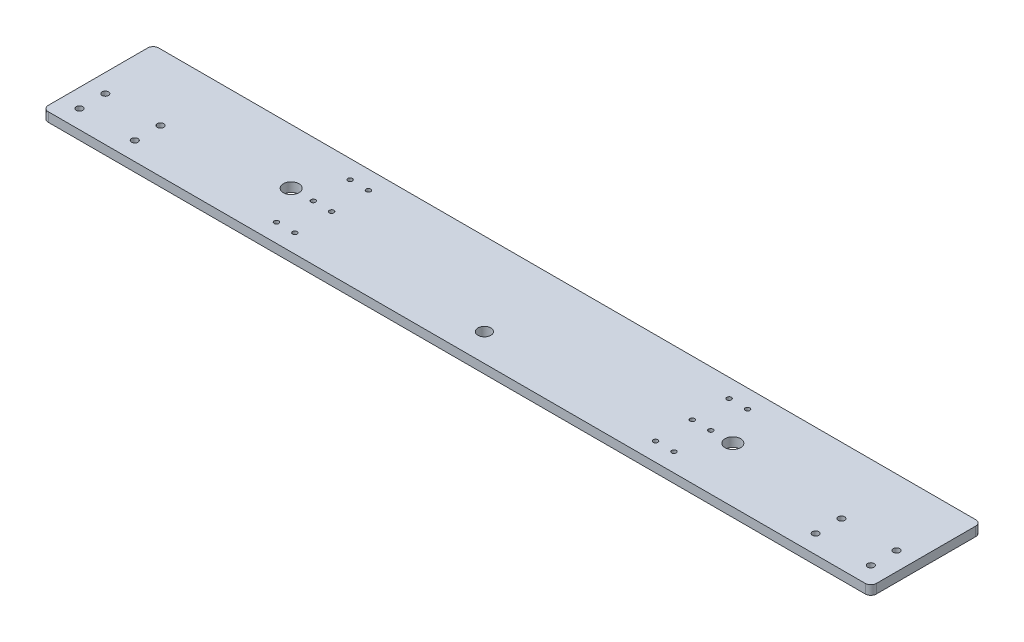
ISO-10303-21;
HEADER;
FILE_DESCRIPTION(('STEP AP214'),'2;1');
FILE_NAME('part.step','',(''),(''),'','','');
FILE_SCHEMA(('AUTOMOTIVE_DESIGN { 1 0 10303 214 1 1 1 1 }'));
ENDSEC;
DATA;
#1=APPLICATION_CONTEXT('core data for automotive mechanical design processes');
#2=APPLICATION_PROTOCOL_DEFINITION('international standard','automotive_design',2000,#1);
#3=PRODUCT_CONTEXT('',#1,'mechanical');
#4=PRODUCT('Part','Part','',(#3));
#5=PRODUCT_RELATED_PRODUCT_CATEGORY('part','',(#4));
#6=PRODUCT_DEFINITION_FORMATION('','',#4);
#7=PRODUCT_DEFINITION_CONTEXT('part definition',#1,'design');
#8=PRODUCT_DEFINITION('design','',#6,#7);
#9=PRODUCT_DEFINITION_SHAPE('','',#8);
#10=(LENGTH_UNIT() NAMED_UNIT(*) SI_UNIT(.MILLI.,.METRE.));
#11=(NAMED_UNIT(*) PLANE_ANGLE_UNIT() SI_UNIT($,.RADIAN.));
#12=(NAMED_UNIT(*) SI_UNIT($,.STERADIAN.) SOLID_ANGLE_UNIT());
#13=UNCERTAINTY_MEASURE_WITH_UNIT(LENGTH_MEASURE(1.E-05),#10,'distance_accuracy_value','');
#14=(GEOMETRIC_REPRESENTATION_CONTEXT(3) GLOBAL_UNCERTAINTY_ASSIGNED_CONTEXT((#13)) GLOBAL_UNIT_ASSIGNED_CONTEXT((#10,
#11,#12)) REPRESENTATION_CONTEXT('',''));
#15=CARTESIAN_POINT('',(0.,0.,0.));
#16=DIRECTION('',(0.,0.,1.));
#17=DIRECTION('',(1.,0.,0.));
#18=AXIS2_PLACEMENT_3D('',#15,#16,#17);
#19=CARTESIAN_POINT('',(-185.,-5.,5.99999999999999));
#20=DIRECTION('',(0.,1.,0.));
#21=DIRECTION('',(0.,0.,1.));
#22=AXIS2_PLACEMENT_3D('',#19,#20,#21);
#23=CYLINDRICAL_SURFACE('',#22,1.74999999999998);
#24=CARTESIAN_POINT('',(-185.,-5.,5.99999999999999));
#25=DIRECTION('',(0.,1.,0.));
#26=DIRECTION('',(0.,0.,1.));
#27=AXIS2_PLACEMENT_3D('',#24,#25,#26);
#28=CIRCLE('',#27,1.74999999999998);
#29=CARTESIAN_POINT('',(-185.,-5.,7.74999999999997));
#30=VERTEX_POINT('',#29);
#31=EDGE_CURVE('E145',#30,#30,#28,.T.);
#32=ORIENTED_EDGE('',*,*,#31,.F.);
#33=EDGE_LOOP('',(#32));
#34=FACE_BOUND('',#33,.T.);
#35=CARTESIAN_POINT('',(-185.,0.,5.99999999999999));
#36=DIRECTION('',(0.,1.,0.));
#37=DIRECTION('',(0.,0.,1.));
#38=AXIS2_PLACEMENT_3D('',#35,#36,#37);
#39=CIRCLE('',#38,1.74999999999998);
#40=CARTESIAN_POINT('',(-185.,0.,7.74999999999997));
#41=VERTEX_POINT('',#40);
#42=EDGE_CURVE('E117',#41,#41,#39,.T.);
#43=ORIENTED_EDGE('',*,*,#42,.T.);
#44=EDGE_LOOP('',(#43));
#45=FACE_BOUND('',#44,.T.);
#46=ADVANCED_FACE('F37',(#34,#45),#23,.F.);
#47=CARTESIAN_POINT('',(-185.,-5.,20.));
#48=DIRECTION('',(0.,1.,0.));
#49=DIRECTION('',(0.,0.,1.));
#50=AXIS2_PLACEMENT_3D('',#47,#48,#49);
#51=CYLINDRICAL_SURFACE('',#50,1.74999999999998);
#52=CARTESIAN_POINT('',(-185.,-5.,20.));
#53=DIRECTION('',(0.,1.,0.));
#54=DIRECTION('',(0.,0.,1.));
#55=AXIS2_PLACEMENT_3D('',#52,#53,#54);
#56=CIRCLE('',#55,1.74999999999998);
#57=CARTESIAN_POINT('',(-185.,-5.,21.75));
#58=VERTEX_POINT('',#57);
#59=EDGE_CURVE('E139',#58,#58,#56,.T.);
#60=ORIENTED_EDGE('',*,*,#59,.F.);
#61=EDGE_LOOP('',(#60));
#62=FACE_BOUND('',#61,.T.);
#63=CARTESIAN_POINT('',(-185.,0.,20.));
#64=DIRECTION('',(0.,1.,0.));
#65=DIRECTION('',(0.,0.,1.));
#66=AXIS2_PLACEMENT_3D('',#63,#64,#65);
#67=CIRCLE('',#66,1.74999999999998);
#68=CARTESIAN_POINT('',(-185.,0.,21.75));
#69=VERTEX_POINT('',#68);
#70=EDGE_CURVE('E142',#69,#69,#67,.T.);
#71=ORIENTED_EDGE('',*,*,#70,.T.);
#72=EDGE_LOOP('',(#71));
#73=FACE_BOUND('',#72,.T.);
#74=ADVANCED_FACE('F374',(#62,#73),#51,.F.);
#75=CARTESIAN_POINT('',(-225.,-5.,30.));
#76=DIRECTION('',(1.,0.,0.));
#77=DIRECTION('',(0.,0.,-1.));
#78=AXIS2_PLACEMENT_3D('',#75,#76,#77);
#79=PLANE('',#78);
#80=DIRECTION('',(0.,0.,-1.));
#81=VECTOR('',#80,1.);
#82=CARTESIAN_POINT('',(-225.,0.,30.));
#83=LINE('',#82,#81);
#84=CARTESIAN_POINT('',(-225.,0.,27.));
#85=VERTEX_POINT('',#84);
#86=CARTESIAN_POINT('',(-225.,0.,-27.));
#87=VERTEX_POINT('',#86);
#88=EDGE_CURVE('E113',#85,#87,#83,.T.);
#89=ORIENTED_EDGE('',*,*,#88,.T.);
#90=DIRECTION('',(0.,1.,0.));
#91=VECTOR('',#90,1.);
#92=CARTESIAN_POINT('',(-225.,-5.,-27.));
#93=LINE('',#92,#91);
#94=CARTESIAN_POINT('',(-225.,-5.,-27.));
#95=VERTEX_POINT('',#94);
#96=EDGE_CURVE('E157',#87,#95,#93,.F.);
#97=ORIENTED_EDGE('',*,*,#96,.T.);
#98=DIRECTION('',(0.,0.,-1.));
#99=VECTOR('',#98,1.);
#100=CARTESIAN_POINT('',(-225.,-5.,30.));
#101=LINE('',#100,#99);
#102=CARTESIAN_POINT('',(-225.,-5.,27.));
#103=VERTEX_POINT('',#102);
#104=EDGE_CURVE('E116',#103,#95,#101,.T.);
#105=ORIENTED_EDGE('',*,*,#104,.F.);
#106=DIRECTION('',(0.,1.,0.));
#107=VECTOR('',#106,1.);
#108=CARTESIAN_POINT('',(-225.,0.,27.));
#109=LINE('',#108,#107);
#110=EDGE_CURVE('E104',#103,#85,#109,.T.);
#111=ORIENTED_EDGE('',*,*,#110,.T.);
#112=EDGE_LOOP('',(#89,#97,#105,#111));
#113=FACE_BOUND('',#112,.T.);
#114=ADVANCED_FACE('F112',(#113),#79,.F.);
#115=CARTESIAN_POINT('',(-225.,-5.,-30.));
#116=DIRECTION('',(0.,0.,1.));
#117=DIRECTION('',(1.,0.,0.));
#118=AXIS2_PLACEMENT_3D('',#115,#116,#117);
#119=PLANE('',#118);
#120=DIRECTION('',(1.,0.,0.));
#121=VECTOR('',#120,1.);
#122=CARTESIAN_POINT('',(-225.,0.,-30.));
#123=LINE('',#122,#121);
#124=CARTESIAN_POINT('',(-222.,0.,-30.));
#125=VERTEX_POINT('',#124);
#126=CARTESIAN_POINT('',(222.,0.,-30.));
#127=VERTEX_POINT('',#126);
#128=EDGE_CURVE('E123',#125,#127,#123,.T.);
#129=ORIENTED_EDGE('',*,*,#128,.T.);
#130=DIRECTION('',(0.,1.,0.));
#131=VECTOR('',#130,1.);
#132=CARTESIAN_POINT('',(222.,-5.,-30.));
#133=LINE('',#132,#131);
#134=CARTESIAN_POINT('',(222.,-5.,-30.));
#135=VERTEX_POINT('',#134);
#136=EDGE_CURVE('E166',#127,#135,#133,.F.);
#137=ORIENTED_EDGE('',*,*,#136,.T.);
#138=DIRECTION('',(1.,0.,0.));
#139=VECTOR('',#138,1.);
#140=CARTESIAN_POINT('',(-225.,-5.,-30.));
#141=LINE('',#140,#139);
#142=CARTESIAN_POINT('',(-222.,-5.,-30.));
#143=VERTEX_POINT('',#142);
#144=EDGE_CURVE('E188',#143,#135,#141,.T.);
#145=ORIENTED_EDGE('',*,*,#144,.F.);
#146=DIRECTION('',(0.,1.,0.));
#147=VECTOR('',#146,1.);
#148=CARTESIAN_POINT('',(-222.,-5.,-30.));
#149=LINE('',#148,#147);
#150=EDGE_CURVE('E153',#143,#125,#149,.T.);
#151=ORIENTED_EDGE('',*,*,#150,.T.);
#152=EDGE_LOOP('',(#129,#137,#145,#151));
#153=FACE_BOUND('',#152,.T.);
#154=ADVANCED_FACE('F403',(#153),#119,.F.);
#155=CARTESIAN_POINT('',(225.,-5.,30.));
#156=DIRECTION('',(1.,0.,0.));
#157=DIRECTION('',(0.,0.,-1.));
#158=AXIS2_PLACEMENT_3D('',#155,#156,#157);
#159=PLANE('',#158);
#160=DIRECTION('',(0.,0.,-1.));
#161=VECTOR('',#160,1.);
#162=CARTESIAN_POINT('',(225.,0.,30.));
#163=LINE('',#162,#161);
#164=CARTESIAN_POINT('',(225.,0.,27.));
#165=VERTEX_POINT('',#164);
#166=CARTESIAN_POINT('',(225.,0.,-27.));
#167=VERTEX_POINT('',#166);
#168=EDGE_CURVE('E127',#165,#167,#163,.T.);
#169=ORIENTED_EDGE('',*,*,#168,.F.);
#170=DIRECTION('',(0.,1.,0.));
#171=VECTOR('',#170,1.);
#172=CARTESIAN_POINT('',(225.,-5.,27.));
#173=LINE('',#172,#171);
#174=CARTESIAN_POINT('',(225.,-5.,27.));
#175=VERTEX_POINT('',#174);
#176=EDGE_CURVE('E45',#165,#175,#173,.F.);
#177=ORIENTED_EDGE('',*,*,#176,.T.);
#178=DIRECTION('',(0.,0.,-1.));
#179=VECTOR('',#178,1.);
#180=CARTESIAN_POINT('',(225.,-5.,30.));
#181=LINE('',#180,#179);
#182=CARTESIAN_POINT('',(225.,-5.,-27.));
#183=VERTEX_POINT('',#182);
#184=EDGE_CURVE('E184',#175,#183,#181,.T.);
#185=ORIENTED_EDGE('',*,*,#184,.T.);
#186=DIRECTION('',(0.,1.,0.));
#187=VECTOR('',#186,1.);
#188=CARTESIAN_POINT('',(225.,0.,-27.));
#189=LINE('',#188,#187);
#190=EDGE_CURVE('E161',#183,#167,#189,.T.);
#191=ORIENTED_EDGE('',*,*,#190,.T.);
#192=EDGE_LOOP('',(#169,#177,#185,#191));
#193=FACE_BOUND('',#192,.T.);
#194=ADVANCED_FACE('F401',(#193),#159,.T.);
#195=CARTESIAN_POINT('',(-225.,-5.,30.));
#196=DIRECTION('',(0.,0.,1.));
#197=DIRECTION('',(1.,0.,0.));
#198=AXIS2_PLACEMENT_3D('',#195,#196,#197);
#199=PLANE('',#198);
#200=DIRECTION('',(1.,0.,0.));
#201=VECTOR('',#200,1.);
#202=CARTESIAN_POINT('',(-225.,-5.,30.));
#203=LINE('',#202,#201);
#204=CARTESIAN_POINT('',(-222.,-5.,30.));
#205=VERTEX_POINT('',#204);
#206=CARTESIAN_POINT('',(222.,-5.,30.));
#207=VERTEX_POINT('',#206);
#208=EDGE_CURVE('E133',#205,#207,#203,.T.);
#209=ORIENTED_EDGE('',*,*,#208,.T.);
#210=DIRECTION('',(0.,1.,0.));
#211=VECTOR('',#210,1.);
#212=CARTESIAN_POINT('',(222.,-5.,30.));
#213=LINE('',#212,#211);
#214=CARTESIAN_POINT('',(222.,0.,30.));
#215=VERTEX_POINT('',#214);
#216=EDGE_CURVE('E171',#207,#215,#213,.T.);
#217=ORIENTED_EDGE('',*,*,#216,.T.);
#218=DIRECTION('',(1.,0.,0.));
#219=VECTOR('',#218,1.);
#220=CARTESIAN_POINT('',(-225.,0.,30.));
#221=LINE('',#220,#219);
#222=CARTESIAN_POINT('',(-222.,0.,30.));
#223=VERTEX_POINT('',#222);
#224=EDGE_CURVE('E137',#223,#215,#221,.T.);
#225=ORIENTED_EDGE('',*,*,#224,.F.);
#226=DIRECTION('',(0.,1.,0.));
#227=VECTOR('',#226,1.);
#228=CARTESIAN_POINT('',(-222.,-5.,30.));
#229=LINE('',#228,#227);
#230=EDGE_CURVE('E105',#223,#205,#229,.F.);
#231=ORIENTED_EDGE('',*,*,#230,.T.);
#232=EDGE_LOOP('',(#209,#217,#225,#231));
#233=FACE_BOUND('',#232,.T.);
#234=ADVANCED_FACE('F177',(#233),#199,.T.);
#235=CARTESIAN_POINT('',(0.,-5.,0.));
#236=DIRECTION('',(0.,-1.,0.));
#237=DIRECTION('',(0.,0.,-1.));
#238=AXIS2_PLACEMENT_3D('',#235,#236,#237);
#239=PLANE('',#238);
#240=CARTESIAN_POINT('',(-98.,-5.,20.));
#241=DIRECTION('',(0.,1.,0.));
#242=DIRECTION('',(0.,0.,1.));
#243=AXIS2_PLACEMENT_3D('',#240,#241,#242);
#244=CIRCLE('',#243,1.25);
#245=CARTESIAN_POINT('',(-98.,-5.,21.25));
#246=VERTEX_POINT('',#245);
#247=EDGE_CURVE('E308',#246,#246,#244,.T.);
#248=ORIENTED_EDGE('',*,*,#247,.T.);
#249=EDGE_LOOP('',(#248));
#250=FACE_BOUND('',#249,.T.);
#251=CARTESIAN_POINT('',(-98.,-5.,0.));
#252=DIRECTION('',(0.,1.,0.));
#253=DIRECTION('',(0.,0.,1.));
#254=AXIS2_PLACEMENT_3D('',#251,#252,#253);
#255=CIRCLE('',#254,1.25);
#256=CARTESIAN_POINT('',(-98.,-5.,1.25));
#257=VERTEX_POINT('',#256);
#258=EDGE_CURVE('E302',#257,#257,#255,.T.);
#259=ORIENTED_EDGE('',*,*,#258,.T.);
#260=EDGE_LOOP('',(#259));
#261=FACE_BOUND('',#260,.T.);
#262=CARTESIAN_POINT('',(-98.,-5.,-20.));
#263=DIRECTION('',(0.,1.,0.));
#264=DIRECTION('',(0.,0.,1.));
#265=AXIS2_PLACEMENT_3D('',#262,#263,#264);
#266=CIRCLE('',#265,1.25);
#267=CARTESIAN_POINT('',(-98.,-5.,-18.75));
#268=VERTEX_POINT('',#267);
#269=EDGE_CURVE('E296',#268,#268,#266,.T.);
#270=ORIENTED_EDGE('',*,*,#269,.T.);
#271=EDGE_LOOP('',(#270));
#272=FACE_BOUND('',#271,.T.);
#273=CARTESIAN_POINT('',(-108.,-5.,-20.));
#274=DIRECTION('',(0.,1.,0.));
#275=DIRECTION('',(0.,0.,1.));
#276=AXIS2_PLACEMENT_3D('',#273,#274,#275);
#277=CIRCLE('',#276,1.25);
#278=CARTESIAN_POINT('',(-108.,-5.,-18.75));
#279=VERTEX_POINT('',#278);
#280=EDGE_CURVE('E290',#279,#279,#277,.T.);
#281=ORIENTED_EDGE('',*,*,#280,.T.);
#282=EDGE_LOOP('',(#281));
#283=FACE_BOUND('',#282,.T.);
#284=CARTESIAN_POINT('',(-108.,-5.,0.));
#285=DIRECTION('',(0.,1.,0.));
#286=DIRECTION('',(0.,0.,1.));
#287=AXIS2_PLACEMENT_3D('',#284,#285,#286);
#288=CIRCLE('',#287,1.25);
#289=CARTESIAN_POINT('',(-108.,-5.,1.25));
#290=VERTEX_POINT('',#289);
#291=EDGE_CURVE('E284',#290,#290,#288,.T.);
#292=ORIENTED_EDGE('',*,*,#291,.T.);
#293=EDGE_LOOP('',(#292));
#294=FACE_BOUND('',#293,.T.);
#295=CARTESIAN_POINT('',(-108.,-5.,20.));
#296=DIRECTION('',(0.,1.,0.));
#297=DIRECTION('',(0.,0.,1.));
#298=AXIS2_PLACEMENT_3D('',#295,#296,#297);
#299=CIRCLE('',#298,1.25);
#300=CARTESIAN_POINT('',(-108.,-5.,21.25));
#301=VERTEX_POINT('',#300);
#302=EDGE_CURVE('E278',#301,#301,#299,.T.);
#303=ORIENTED_EDGE('',*,*,#302,.T.);
#304=EDGE_LOOP('',(#303));
#305=FACE_BOUND('',#304,.T.);
#306=CARTESIAN_POINT('',(98.,-5.,20.));
#307=DIRECTION('',(0.,1.,0.));
#308=DIRECTION('',(0.,0.,1.));
#309=AXIS2_PLACEMENT_3D('',#306,#307,#308);
#310=CIRCLE('',#309,1.25);
#311=CARTESIAN_POINT('',(98.,-5.,21.25));
#312=VERTEX_POINT('',#311);
#313=EDGE_CURVE('E272',#312,#312,#310,.T.);
#314=ORIENTED_EDGE('',*,*,#313,.T.);
#315=EDGE_LOOP('',(#314));
#316=FACE_BOUND('',#315,.T.);
#317=CARTESIAN_POINT('',(108.,-5.,20.));
#318=DIRECTION('',(0.,1.,0.));
#319=DIRECTION('',(0.,0.,1.));
#320=AXIS2_PLACEMENT_3D('',#317,#318,#319);
#321=CIRCLE('',#320,1.25);
#322=CARTESIAN_POINT('',(108.,-5.,21.25));
#323=VERTEX_POINT('',#322);
#324=EDGE_CURVE('E266',#323,#323,#321,.T.);
#325=ORIENTED_EDGE('',*,*,#324,.T.);
#326=EDGE_LOOP('',(#325));
#327=FACE_BOUND('',#326,.T.);
#328=CARTESIAN_POINT('',(98.,-5.,0.));
#329=DIRECTION('',(0.,1.,0.));
#330=DIRECTION('',(0.,0.,1.));
#331=AXIS2_PLACEMENT_3D('',#328,#329,#330);
#332=CIRCLE('',#331,1.25);
#333=CARTESIAN_POINT('',(98.,-5.,1.25));
#334=VERTEX_POINT('',#333);
#335=EDGE_CURVE('E260',#334,#334,#332,.T.);
#336=ORIENTED_EDGE('',*,*,#335,.T.);
#337=EDGE_LOOP('',(#336));
#338=FACE_BOUND('',#337,.T.);
#339=CARTESIAN_POINT('',(108.,-5.,0.));
#340=DIRECTION('',(0.,1.,0.));
#341=DIRECTION('',(0.,0.,1.));
#342=AXIS2_PLACEMENT_3D('',#339,#340,#341);
#343=CIRCLE('',#342,1.25);
#344=CARTESIAN_POINT('',(108.,-5.,1.25));
#345=VERTEX_POINT('',#344);
#346=EDGE_CURVE('E254',#345,#345,#343,.T.);
#347=ORIENTED_EDGE('',*,*,#346,.T.);
#348=EDGE_LOOP('',(#347));
#349=FACE_BOUND('',#348,.T.);
#350=CARTESIAN_POINT('',(108.,-5.,-20.));
#351=DIRECTION('',(0.,1.,0.));
#352=DIRECTION('',(0.,0.,1.));
#353=AXIS2_PLACEMENT_3D('',#350,#351,#352);
#354=CIRCLE('',#353,1.25);
#355=CARTESIAN_POINT('',(108.,-5.,-18.75));
#356=VERTEX_POINT('',#355);
#357=EDGE_CURVE('E248',#356,#356,#354,.T.);
#358=ORIENTED_EDGE('',*,*,#357,.T.);
#359=EDGE_LOOP('',(#358));
#360=FACE_BOUND('',#359,.T.);
#361=CARTESIAN_POINT('',(98.,-5.,-20.));
#362=DIRECTION('',(0.,1.,0.));
#363=DIRECTION('',(0.,0.,1.));
#364=AXIS2_PLACEMENT_3D('',#361,#362,#363);
#365=CIRCLE('',#364,1.25);
#366=CARTESIAN_POINT('',(98.,-5.,-18.75));
#367=VERTEX_POINT('',#366);
#368=EDGE_CURVE('E242',#367,#367,#365,.T.);
#369=ORIENTED_EDGE('',*,*,#368,.T.);
#370=EDGE_LOOP('',(#369));
#371=FACE_BOUND('',#370,.T.);
#372=CARTESIAN_POINT('',(120.,-5.,0.));
#373=DIRECTION('',(0.,-1.,0.));
#374=DIRECTION('',(0.,0.,-1.));
#375=AXIS2_PLACEMENT_3D('',#372,#373,#374);
#376=CIRCLE('',#375,4.25000000000001);
#377=CARTESIAN_POINT('',(120.,-5.,-4.25000000000001));
#378=VERTEX_POINT('',#377);
#379=EDGE_CURVE('E236',#378,#378,#376,.F.);
#380=ORIENTED_EDGE('',*,*,#379,.T.);
#381=EDGE_LOOP('',(#380));
#382=FACE_BOUND('',#381,.T.);
#383=CARTESIAN_POINT('',(-120.,-5.,0.));
#384=DIRECTION('',(0.,-1.,0.));
#385=DIRECTION('',(0.,0.,-1.));
#386=AXIS2_PLACEMENT_3D('',#383,#384,#385);
#387=CIRCLE('',#386,4.25000000000001);
#388=CARTESIAN_POINT('',(-120.,-5.,-4.25000000000001));
#389=VERTEX_POINT('',#388);
#390=EDGE_CURVE('E217',#389,#389,#387,.T.);
#391=ORIENTED_EDGE('',*,*,#390,.F.);
#392=EDGE_LOOP('',(#391));
#393=FACE_BOUND('',#392,.T.);
#394=CARTESIAN_POINT('',(185.,-5.,20.));
#395=DIRECTION('',(0.,-1.,0.));
#396=DIRECTION('',(0.,0.,1.));
#397=AXIS2_PLACEMENT_3D('',#394,#395,#396);
#398=CIRCLE('',#397,1.74999999999998);
#399=CARTESIAN_POINT('',(185.,-5.,21.75));
#400=VERTEX_POINT('',#399);
#401=EDGE_CURVE('E210',#400,#400,#398,.T.);
#402=ORIENTED_EDGE('',*,*,#401,.F.);
#403=EDGE_LOOP('',(#402));
#404=FACE_BOUND('',#403,.T.);
#405=CARTESIAN_POINT('',(215.,-5.,5.99999999999999));
#406=DIRECTION('',(0.,-1.,0.));
#407=DIRECTION('',(0.,0.,1.));
#408=AXIS2_PLACEMENT_3D('',#405,#406,#407);
#409=CIRCLE('',#408,1.74999999999998);
#410=CARTESIAN_POINT('',(215.,-5.,7.74999999999997));
#411=VERTEX_POINT('',#410);
#412=EDGE_CURVE('E223',#411,#411,#409,.T.);
#413=ORIENTED_EDGE('',*,*,#412,.F.);
#414=EDGE_LOOP('',(#413));
#415=FACE_BOUND('',#414,.T.);
#416=CARTESIAN_POINT('',(185.,-5.,5.99999999999999));
#417=DIRECTION('',(0.,-1.,0.));
#418=DIRECTION('',(0.,0.,1.));
#419=AXIS2_PLACEMENT_3D('',#416,#417,#418);
#420=CIRCLE('',#419,1.74999999999998);
#421=CARTESIAN_POINT('',(185.,-5.,7.74999999999997));
#422=VERTEX_POINT('',#421);
#423=EDGE_CURVE('E216',#422,#422,#420,.T.);
#424=ORIENTED_EDGE('',*,*,#423,.F.);
#425=EDGE_LOOP('',(#424));
#426=FACE_BOUND('',#425,.T.);
#427=CARTESIAN_POINT('',(215.,-5.,20.));
#428=DIRECTION('',(0.,-1.,0.));
#429=DIRECTION('',(0.,0.,1.));
#430=AXIS2_PLACEMENT_3D('',#427,#428,#429);
#431=CIRCLE('',#430,1.74999999999998);
#432=CARTESIAN_POINT('',(215.,-5.,21.75));
#433=VERTEX_POINT('',#432);
#434=EDGE_CURVE('E206',#433,#433,#431,.T.);
#435=ORIENTED_EDGE('',*,*,#434,.F.);
#436=EDGE_LOOP('',(#435));
#437=FACE_BOUND('',#436,.T.);
#438=CARTESIAN_POINT('',(-215.,-5.,5.99999999999999));
#439=DIRECTION('',(0.,1.,0.));
#440=DIRECTION('',(0.,0.,1.));
#441=AXIS2_PLACEMENT_3D('',#438,#439,#440);
#442=CIRCLE('',#441,1.74999999999998);
#443=CARTESIAN_POINT('',(-215.,-5.,7.74999999999997));
#444=VERTEX_POINT('',#443);
#445=EDGE_CURVE('E203',#444,#444,#442,.T.);
#446=ORIENTED_EDGE('',*,*,#445,.T.);
#447=EDGE_LOOP('',(#446));
#448=FACE_BOUND('',#447,.T.);
#449=CARTESIAN_POINT('',(-215.,-5.,20.));
#450=DIRECTION('',(0.,1.,0.));
#451=DIRECTION('',(0.,0.,1.));
#452=AXIS2_PLACEMENT_3D('',#449,#450,#451);
#453=CIRCLE('',#452,1.74999999999998);
#454=CARTESIAN_POINT('',(-215.,-5.,21.75));
#455=VERTEX_POINT('',#454);
#456=EDGE_CURVE('E193',#455,#455,#453,.T.);
#457=ORIENTED_EDGE('',*,*,#456,.T.);
#458=EDGE_LOOP('',(#457));
#459=FACE_BOUND('',#458,.T.);
#460=CARTESIAN_POINT('',(0.,-5.,15.));
#461=DIRECTION('',(0.,1.,0.));
#462=DIRECTION('',(0.,0.,1.));
#463=AXIS2_PLACEMENT_3D('',#460,#461,#462);
#464=CIRCLE('',#463,3.5);
#465=CARTESIAN_POINT('',(0.,-5.,18.5));
#466=VERTEX_POINT('',#465);
#467=EDGE_CURVE('E124',#466,#466,#464,.T.);
#468=ORIENTED_EDGE('',*,*,#467,.T.);
#469=EDGE_LOOP('',(#468));
#470=FACE_BOUND('',#469,.T.);
#471=ORIENTED_EDGE('',*,*,#184,.F.);
#472=CARTESIAN_POINT('',(222.,-5.,27.));
#473=DIRECTION('',(0.,-1.,0.));
#474=DIRECTION('',(0.,0.,-1.));
#475=AXIS2_PLACEMENT_3D('',#472,#473,#474);
#476=CIRCLE('',#475,3.);
#477=EDGE_CURVE('E11',#175,#207,#476,.T.);
#478=ORIENTED_EDGE('',*,*,#477,.T.);
#479=ORIENTED_EDGE('',*,*,#208,.F.);
#480=CARTESIAN_POINT('',(-222.,-5.,27.));
#481=DIRECTION('',(0.,-1.,0.));
#482=DIRECTION('',(0.,0.,-1.));
#483=AXIS2_PLACEMENT_3D('',#480,#481,#482);
#484=CIRCLE('',#483,3.);
#485=EDGE_CURVE('E151',#205,#103,#484,.T.);
#486=ORIENTED_EDGE('',*,*,#485,.T.);
#487=ORIENTED_EDGE('',*,*,#104,.T.);
#488=CARTESIAN_POINT('',(-222.,-5.,-27.));
#489=DIRECTION('',(0.,-1.,0.));
#490=DIRECTION('',(0.,0.,-1.));
#491=AXIS2_PLACEMENT_3D('',#488,#489,#490);
#492=CIRCLE('',#491,3.);
#493=EDGE_CURVE('E159',#95,#143,#492,.T.);
#494=ORIENTED_EDGE('',*,*,#493,.T.);
#495=ORIENTED_EDGE('',*,*,#144,.T.);
#496=CARTESIAN_POINT('',(222.,-5.,-27.));
#497=DIRECTION('',(0.,-1.,0.));
#498=DIRECTION('',(0.,0.,-1.));
#499=AXIS2_PLACEMENT_3D('',#496,#497,#498);
#500=CIRCLE('',#499,3.);
#501=EDGE_CURVE('E168',#135,#183,#500,.T.);
#502=ORIENTED_EDGE('',*,*,#501,.T.);
#503=EDGE_LOOP('',(#471,#478,#479,#486,#487,#494,#495,#502));
#504=FACE_BOUND('',#503,.T.);
#505=ORIENTED_EDGE('',*,*,#59,.T.);
#506=EDGE_LOOP('',(#505));
#507=FACE_BOUND('',#506,.T.);
#508=ORIENTED_EDGE('',*,*,#31,.T.);
#509=EDGE_LOOP('',(#508));
#510=FACE_BOUND('',#509,.T.);
#511=ADVANCED_FACE('F182',(#250,#261,#272,#283,#294,#305,#316,#327,#338,#349,#360,#371,#382,
#393,#404,#415,#426,#437,#448,#459,#470,#504,#507,#510),#239,.T.);
#512=CARTESIAN_POINT('',(0.,0.,0.));
#513=DIRECTION('',(0.,-1.,0.));
#514=DIRECTION('',(0.,0.,-1.));
#515=AXIS2_PLACEMENT_3D('',#512,#513,#514);
#516=PLANE('',#515);
#517=CARTESIAN_POINT('',(-98.,0.,20.));
#518=DIRECTION('',(0.,1.,0.));
#519=DIRECTION('',(0.,0.,1.));
#520=AXIS2_PLACEMENT_3D('',#517,#518,#519);
#521=CIRCLE('',#520,1.24999999999999);
#522=CARTESIAN_POINT('',(-98.,0.,21.25));
#523=VERTEX_POINT('',#522);
#524=EDGE_CURVE('E311',#523,#523,#521,.T.);
#525=ORIENTED_EDGE('',*,*,#524,.F.);
#526=EDGE_LOOP('',(#525));
#527=FACE_BOUND('',#526,.T.);
#528=CARTESIAN_POINT('',(-98.,0.,0.));
#529=DIRECTION('',(0.,1.,0.));
#530=DIRECTION('',(0.,0.,1.));
#531=AXIS2_PLACEMENT_3D('',#528,#529,#530);
#532=CIRCLE('',#531,1.24999999999999);
#533=CARTESIAN_POINT('',(-98.,0.,1.24999999999998));
#534=VERTEX_POINT('',#533);
#535=EDGE_CURVE('E305',#534,#534,#532,.T.);
#536=ORIENTED_EDGE('',*,*,#535,.F.);
#537=EDGE_LOOP('',(#536));
#538=FACE_BOUND('',#537,.T.);
#539=CARTESIAN_POINT('',(-98.,0.,-20.));
#540=DIRECTION('',(0.,1.,0.));
#541=DIRECTION('',(0.,0.,1.));
#542=AXIS2_PLACEMENT_3D('',#539,#540,#541);
#543=CIRCLE('',#542,1.24999999999999);
#544=CARTESIAN_POINT('',(-98.,0.,-18.75));
#545=VERTEX_POINT('',#544);
#546=EDGE_CURVE('E299',#545,#545,#543,.T.);
#547=ORIENTED_EDGE('',*,*,#546,.F.);
#548=EDGE_LOOP('',(#547));
#549=FACE_BOUND('',#548,.T.);
#550=CARTESIAN_POINT('',(-108.,0.,-20.));
#551=DIRECTION('',(0.,1.,0.));
#552=DIRECTION('',(0.,0.,1.));
#553=AXIS2_PLACEMENT_3D('',#550,#551,#552);
#554=CIRCLE('',#553,1.24999999999999);
#555=CARTESIAN_POINT('',(-108.,0.,-18.75));
#556=VERTEX_POINT('',#555);
#557=EDGE_CURVE('E293',#556,#556,#554,.T.);
#558=ORIENTED_EDGE('',*,*,#557,.F.);
#559=EDGE_LOOP('',(#558));
#560=FACE_BOUND('',#559,.T.);
#561=CARTESIAN_POINT('',(-108.,0.,0.));
#562=DIRECTION('',(0.,1.,0.));
#563=DIRECTION('',(0.,0.,1.));
#564=AXIS2_PLACEMENT_3D('',#561,#562,#563);
#565=CIRCLE('',#564,1.24999999999999);
#566=CARTESIAN_POINT('',(-108.,0.,1.24999999999998));
#567=VERTEX_POINT('',#566);
#568=EDGE_CURVE('E287',#567,#567,#565,.T.);
#569=ORIENTED_EDGE('',*,*,#568,.F.);
#570=EDGE_LOOP('',(#569));
#571=FACE_BOUND('',#570,.T.);
#572=CARTESIAN_POINT('',(-108.,0.,20.));
#573=DIRECTION('',(0.,1.,0.));
#574=DIRECTION('',(0.,0.,1.));
#575=AXIS2_PLACEMENT_3D('',#572,#573,#574);
#576=CIRCLE('',#575,1.24999999999999);
#577=CARTESIAN_POINT('',(-108.,0.,21.25));
#578=VERTEX_POINT('',#577);
#579=EDGE_CURVE('E281',#578,#578,#576,.T.);
#580=ORIENTED_EDGE('',*,*,#579,.F.);
#581=EDGE_LOOP('',(#580));
#582=FACE_BOUND('',#581,.T.);
#583=CARTESIAN_POINT('',(98.,0.,20.));
#584=DIRECTION('',(0.,1.,0.));
#585=DIRECTION('',(0.,0.,1.));
#586=AXIS2_PLACEMENT_3D('',#583,#584,#585);
#587=CIRCLE('',#586,1.24999999999999);
#588=CARTESIAN_POINT('',(98.,0.,21.25));
#589=VERTEX_POINT('',#588);
#590=EDGE_CURVE('E275',#589,#589,#587,.T.);
#591=ORIENTED_EDGE('',*,*,#590,.F.);
#592=EDGE_LOOP('',(#591));
#593=FACE_BOUND('',#592,.T.);
#594=CARTESIAN_POINT('',(108.,0.,20.));
#595=DIRECTION('',(0.,1.,0.));
#596=DIRECTION('',(0.,0.,1.));
#597=AXIS2_PLACEMENT_3D('',#594,#595,#596);
#598=CIRCLE('',#597,1.24999999999999);
#599=CARTESIAN_POINT('',(108.,0.,21.25));
#600=VERTEX_POINT('',#599);
#601=EDGE_CURVE('E269',#600,#600,#598,.T.);
#602=ORIENTED_EDGE('',*,*,#601,.F.);
#603=EDGE_LOOP('',(#602));
#604=FACE_BOUND('',#603,.T.);
#605=CARTESIAN_POINT('',(98.,0.,0.));
#606=DIRECTION('',(0.,1.,0.));
#607=DIRECTION('',(0.,0.,1.));
#608=AXIS2_PLACEMENT_3D('',#605,#606,#607);
#609=CIRCLE('',#608,1.24999999999999);
#610=CARTESIAN_POINT('',(98.,0.,1.24999999999998));
#611=VERTEX_POINT('',#610);
#612=EDGE_CURVE('E263',#611,#611,#609,.T.);
#613=ORIENTED_EDGE('',*,*,#612,.F.);
#614=EDGE_LOOP('',(#613));
#615=FACE_BOUND('',#614,.T.);
#616=CARTESIAN_POINT('',(108.,0.,0.));
#617=DIRECTION('',(0.,1.,0.));
#618=DIRECTION('',(0.,0.,1.));
#619=AXIS2_PLACEMENT_3D('',#616,#617,#618);
#620=CIRCLE('',#619,1.24999999999999);
#621=CARTESIAN_POINT('',(108.,0.,1.24999999999998));
#622=VERTEX_POINT('',#621);
#623=EDGE_CURVE('E257',#622,#622,#620,.T.);
#624=ORIENTED_EDGE('',*,*,#623,.F.);
#625=EDGE_LOOP('',(#624));
#626=FACE_BOUND('',#625,.T.);
#627=CARTESIAN_POINT('',(108.,0.,-20.));
#628=DIRECTION('',(0.,1.,0.));
#629=DIRECTION('',(0.,0.,1.));
#630=AXIS2_PLACEMENT_3D('',#627,#628,#629);
#631=CIRCLE('',#630,1.24999999999999);
#632=CARTESIAN_POINT('',(108.,0.,-18.75));
#633=VERTEX_POINT('',#632);
#634=EDGE_CURVE('E251',#633,#633,#631,.T.);
#635=ORIENTED_EDGE('',*,*,#634,.F.);
#636=EDGE_LOOP('',(#635));
#637=FACE_BOUND('',#636,.T.);
#638=CARTESIAN_POINT('',(98.,0.,-20.));
#639=DIRECTION('',(0.,1.,0.));
#640=DIRECTION('',(0.,0.,1.));
#641=AXIS2_PLACEMENT_3D('',#638,#639,#640);
#642=CIRCLE('',#641,1.24999999999999);
#643=CARTESIAN_POINT('',(98.,0.,-18.75));
#644=VERTEX_POINT('',#643);
#645=EDGE_CURVE('E245',#644,#644,#642,.T.);
#646=ORIENTED_EDGE('',*,*,#645,.F.);
#647=EDGE_LOOP('',(#646));
#648=FACE_BOUND('',#647,.T.);
#649=CARTESIAN_POINT('',(120.,0.,0.));
#650=DIRECTION('',(0.,-1.,0.));
#651=DIRECTION('',(0.,0.,1.));
#652=AXIS2_PLACEMENT_3D('',#649,#650,#651);
#653=CIRCLE('',#652,4.25000000000001);
#654=CARTESIAN_POINT('',(120.,0.,4.25000000000001));
#655=VERTEX_POINT('',#654);
#656=EDGE_CURVE('E239',#655,#655,#653,.T.);
#657=ORIENTED_EDGE('',*,*,#656,.T.);
#658=EDGE_LOOP('',(#657));
#659=FACE_BOUND('',#658,.T.);
#660=CARTESIAN_POINT('',(-120.,0.,0.));
#661=DIRECTION('',(0.,1.,0.));
#662=DIRECTION('',(0.,0.,1.));
#663=AXIS2_PLACEMENT_3D('',#660,#661,#662);
#664=CIRCLE('',#663,4.25000000000001);
#665=CARTESIAN_POINT('',(-120.,0.,4.25000000000001));
#666=VERTEX_POINT('',#665);
#667=EDGE_CURVE('E233',#666,#666,#664,.T.);
#668=ORIENTED_EDGE('',*,*,#667,.F.);
#669=EDGE_LOOP('',(#668));
#670=FACE_BOUND('',#669,.T.);
#671=CARTESIAN_POINT('',(185.,0.,20.));
#672=DIRECTION('',(0.,-1.,0.));
#673=DIRECTION('',(0.,0.,1.));
#674=AXIS2_PLACEMENT_3D('',#671,#672,#673);
#675=CIRCLE('',#674,1.74999999999998);
#676=CARTESIAN_POINT('',(185.,0.,21.75));
#677=VERTEX_POINT('',#676);
#678=EDGE_CURVE('E226',#677,#677,#675,.T.);
#679=ORIENTED_EDGE('',*,*,#678,.T.);
#680=EDGE_LOOP('',(#679));
#681=FACE_BOUND('',#680,.T.);
#682=CARTESIAN_POINT('',(215.,0.,5.99999999999999));
#683=DIRECTION('',(0.,-1.,0.));
#684=DIRECTION('',(0.,0.,1.));
#685=AXIS2_PLACEMENT_3D('',#682,#683,#684);
#686=CIRCLE('',#685,1.74999999999998);
#687=CARTESIAN_POINT('',(215.,0.,7.74999999999997));
#688=VERTEX_POINT('',#687);
#689=EDGE_CURVE('E220',#688,#688,#686,.T.);
#690=ORIENTED_EDGE('',*,*,#689,.T.);
#691=EDGE_LOOP('',(#690));
#692=FACE_BOUND('',#691,.T.);
#693=CARTESIAN_POINT('',(185.,0.,5.99999999999999));
#694=DIRECTION('',(0.,-1.,0.));
#695=DIRECTION('',(0.,0.,1.));
#696=AXIS2_PLACEMENT_3D('',#693,#694,#695);
#697=CIRCLE('',#696,1.74999999999998);
#698=CARTESIAN_POINT('',(185.,0.,7.74999999999997));
#699=VERTEX_POINT('',#698);
#700=EDGE_CURVE('E213',#699,#699,#697,.T.);
#701=ORIENTED_EDGE('',*,*,#700,.T.);
#702=EDGE_LOOP('',(#701));
#703=FACE_BOUND('',#702,.T.);
#704=CARTESIAN_POINT('',(215.,0.,20.));
#705=DIRECTION('',(0.,-1.,0.));
#706=DIRECTION('',(0.,0.,1.));
#707=AXIS2_PLACEMENT_3D('',#704,#705,#706);
#708=CIRCLE('',#707,1.74999999999998);
#709=CARTESIAN_POINT('',(215.,0.,21.75));
#710=VERTEX_POINT('',#709);
#711=EDGE_CURVE('E207',#710,#710,#708,.T.);
#712=ORIENTED_EDGE('',*,*,#711,.T.);
#713=EDGE_LOOP('',(#712));
#714=FACE_BOUND('',#713,.T.);
#715=CARTESIAN_POINT('',(-215.,0.,5.99999999999999));
#716=DIRECTION('',(0.,1.,0.));
#717=DIRECTION('',(0.,0.,1.));
#718=AXIS2_PLACEMENT_3D('',#715,#716,#717);
#719=CIRCLE('',#718,1.74999999999998);
#720=CARTESIAN_POINT('',(-215.,0.,7.74999999999997));
#721=VERTEX_POINT('',#720);
#722=EDGE_CURVE('E198',#721,#721,#719,.T.);
#723=ORIENTED_EDGE('',*,*,#722,.F.);
#724=EDGE_LOOP('',(#723));
#725=FACE_BOUND('',#724,.T.);
#726=CARTESIAN_POINT('',(-215.,0.,20.));
#727=DIRECTION('',(0.,1.,0.));
#728=DIRECTION('',(0.,0.,1.));
#729=AXIS2_PLACEMENT_3D('',#726,#727,#728);
#730=CIRCLE('',#729,1.74999999999998);
#731=CARTESIAN_POINT('',(-215.,0.,21.75));
#732=VERTEX_POINT('',#731);
#733=EDGE_CURVE('E195',#732,#732,#730,.T.);
#734=ORIENTED_EDGE('',*,*,#733,.F.);
#735=EDGE_LOOP('',(#734));
#736=FACE_BOUND('',#735,.T.);
#737=CARTESIAN_POINT('',(0.,0.,15.));
#738=DIRECTION('',(0.,1.,0.));
#739=DIRECTION('',(0.,0.,1.));
#740=AXIS2_PLACEMENT_3D('',#737,#738,#739);
#741=CIRCLE('',#740,3.5);
#742=CARTESIAN_POINT('',(0.,0.,18.5));
#743=VERTEX_POINT('',#742);
#744=EDGE_CURVE('E130',#743,#743,#741,.T.);
#745=ORIENTED_EDGE('',*,*,#744,.F.);
#746=EDGE_LOOP('',(#745));
#747=FACE_BOUND('',#746,.T.);
#748=ORIENTED_EDGE('',*,*,#224,.T.);
#749=CARTESIAN_POINT('',(222.,0.,27.));
#750=DIRECTION('',(0.,-1.,0.));
#751=DIRECTION('',(0.,0.,-1.));
#752=AXIS2_PLACEMENT_3D('',#749,#750,#751);
#753=CIRCLE('',#752,3.);
#754=EDGE_CURVE('E59',#215,#165,#753,.F.);
#755=ORIENTED_EDGE('',*,*,#754,.T.);
#756=ORIENTED_EDGE('',*,*,#168,.T.);
#757=CARTESIAN_POINT('',(222.,0.,-27.));
#758=DIRECTION('',(0.,-1.,0.));
#759=DIRECTION('',(0.,0.,-1.));
#760=AXIS2_PLACEMENT_3D('',#757,#758,#759);
#761=CIRCLE('',#760,3.);
#762=EDGE_CURVE('E164',#167,#127,#761,.F.);
#763=ORIENTED_EDGE('',*,*,#762,.T.);
#764=ORIENTED_EDGE('',*,*,#128,.F.);
#765=CARTESIAN_POINT('',(-222.,0.,-27.));
#766=DIRECTION('',(0.,-1.,0.));
#767=DIRECTION('',(0.,0.,-1.));
#768=AXIS2_PLACEMENT_3D('',#765,#766,#767);
#769=CIRCLE('',#768,3.);
#770=EDGE_CURVE('E122',#125,#87,#769,.F.);
#771=ORIENTED_EDGE('',*,*,#770,.T.);
#772=ORIENTED_EDGE('',*,*,#88,.F.);
#773=CARTESIAN_POINT('',(-222.,0.,27.));
#774=DIRECTION('',(0.,-1.,0.));
#775=DIRECTION('',(0.,0.,-1.));
#776=AXIS2_PLACEMENT_3D('',#773,#774,#775);
#777=CIRCLE('',#776,3.);
#778=EDGE_CURVE('E100',#85,#223,#777,.F.);
#779=ORIENTED_EDGE('',*,*,#778,.T.);
#780=EDGE_LOOP('',(#748,#755,#756,#763,#764,#771,#772,#779));
#781=FACE_BOUND('',#780,.T.);
#782=ORIENTED_EDGE('',*,*,#70,.F.);
#783=EDGE_LOOP('',(#782));
#784=FACE_BOUND('',#783,.T.);
#785=ORIENTED_EDGE('',*,*,#42,.F.);
#786=EDGE_LOOP('',(#785));
#787=FACE_BOUND('',#786,.T.);
#788=ADVANCED_FACE('F119',(#527,#538,#549,#560,#571,#582,#593,#604,#615,#626,#637,#648,#659,
#670,#681,#692,#703,#714,#725,#736,#747,#781,#784,#787),#516,.F.);
#789=CARTESIAN_POINT('',(0.,-5.,15.));
#790=DIRECTION('',(0.,1.,0.));
#791=DIRECTION('',(0.,0.,1.));
#792=AXIS2_PLACEMENT_3D('',#789,#790,#791);
#793=CYLINDRICAL_SURFACE('',#792,3.5);
#794=ORIENTED_EDGE('',*,*,#467,.F.);
#795=EDGE_LOOP('',(#794));
#796=FACE_BOUND('',#795,.T.);
#797=ORIENTED_EDGE('',*,*,#744,.T.);
#798=EDGE_LOOP('',(#797));
#799=FACE_BOUND('',#798,.T.);
#800=ADVANCED_FACE('F319',(#796,#799),#793,.F.);
#801=CARTESIAN_POINT('',(-215.,-5.,20.));
#802=DIRECTION('',(0.,1.,0.));
#803=DIRECTION('',(0.,0.,1.));
#804=AXIS2_PLACEMENT_3D('',#801,#802,#803);
#805=CYLINDRICAL_SURFACE('',#804,1.74999999999998);
#806=ORIENTED_EDGE('',*,*,#456,.F.);
#807=EDGE_LOOP('',(#806));
#808=FACE_BOUND('',#807,.T.);
#809=ORIENTED_EDGE('',*,*,#733,.T.);
#810=EDGE_LOOP('',(#809));
#811=FACE_BOUND('',#810,.T.);
#812=ADVANCED_FACE('F362',(#808,#811),#805,.F.);
#813=CARTESIAN_POINT('',(-215.,-5.,5.99999999999999));
#814=DIRECTION('',(0.,1.,0.));
#815=DIRECTION('',(0.,0.,1.));
#816=AXIS2_PLACEMENT_3D('',#813,#814,#815);
#817=CYLINDRICAL_SURFACE('',#816,1.74999999999998);
#818=ORIENTED_EDGE('',*,*,#445,.F.);
#819=EDGE_LOOP('',(#818));
#820=FACE_BOUND('',#819,.T.);
#821=ORIENTED_EDGE('',*,*,#722,.T.);
#822=EDGE_LOOP('',(#821));
#823=FACE_BOUND('',#822,.T.);
#824=ADVANCED_FACE('F368',(#820,#823),#817,.F.);
#825=CARTESIAN_POINT('',(215.,-5.,20.));
#826=DIRECTION('',(0.,1.,0.));
#827=DIRECTION('',(0.,0.,1.));
#828=AXIS2_PLACEMENT_3D('',#825,#826,#827);
#829=CYLINDRICAL_SURFACE('',#828,1.74999999999998);
#830=ORIENTED_EDGE('',*,*,#434,.T.);
#831=EDGE_LOOP('',(#830));
#832=FACE_BOUND('',#831,.T.);
#833=ORIENTED_EDGE('',*,*,#711,.F.);
#834=EDGE_LOOP('',(#833));
#835=FACE_BOUND('',#834,.T.);
#836=ADVANCED_FACE('F464',(#832,#835),#829,.F.);
#837=CARTESIAN_POINT('',(185.,-5.,5.99999999999999));
#838=DIRECTION('',(0.,1.,0.));
#839=DIRECTION('',(0.,0.,1.));
#840=AXIS2_PLACEMENT_3D('',#837,#838,#839);
#841=CYLINDRICAL_SURFACE('',#840,1.74999999999998);
#842=ORIENTED_EDGE('',*,*,#423,.T.);
#843=EDGE_LOOP('',(#842));
#844=FACE_BOUND('',#843,.T.);
#845=ORIENTED_EDGE('',*,*,#700,.F.);
#846=EDGE_LOOP('',(#845));
#847=FACE_BOUND('',#846,.T.);
#848=ADVANCED_FACE('F469',(#844,#847),#841,.F.);
#849=CARTESIAN_POINT('',(215.,-5.,5.99999999999999));
#850=DIRECTION('',(0.,1.,0.));
#851=DIRECTION('',(0.,0.,1.));
#852=AXIS2_PLACEMENT_3D('',#849,#850,#851);
#853=CYLINDRICAL_SURFACE('',#852,1.74999999999998);
#854=ORIENTED_EDGE('',*,*,#412,.T.);
#855=EDGE_LOOP('',(#854));
#856=FACE_BOUND('',#855,.T.);
#857=ORIENTED_EDGE('',*,*,#689,.F.);
#858=EDGE_LOOP('',(#857));
#859=FACE_BOUND('',#858,.T.);
#860=ADVANCED_FACE('F475',(#856,#859),#853,.F.);
#861=CARTESIAN_POINT('',(185.,-5.,20.));
#862=DIRECTION('',(0.,1.,0.));
#863=DIRECTION('',(0.,0.,1.));
#864=AXIS2_PLACEMENT_3D('',#861,#862,#863);
#865=CYLINDRICAL_SURFACE('',#864,1.74999999999998);
#866=ORIENTED_EDGE('',*,*,#401,.T.);
#867=EDGE_LOOP('',(#866));
#868=FACE_BOUND('',#867,.T.);
#869=ORIENTED_EDGE('',*,*,#678,.F.);
#870=EDGE_LOOP('',(#869));
#871=FACE_BOUND('',#870,.T.);
#872=ADVANCED_FACE('F479',(#868,#871),#865,.F.);
#873=CARTESIAN_POINT('',(-120.,-10.,0.));
#874=DIRECTION('',(0.,1.,0.));
#875=DIRECTION('',(0.,0.,1.));
#876=AXIS2_PLACEMENT_3D('',#873,#874,#875);
#877=CYLINDRICAL_SURFACE('',#876,4.25000000000001);
#878=ORIENTED_EDGE('',*,*,#390,.T.);
#879=EDGE_LOOP('',(#878));
#880=FACE_BOUND('',#879,.T.);
#881=ORIENTED_EDGE('',*,*,#667,.T.);
#882=EDGE_LOOP('',(#881));
#883=FACE_BOUND('',#882,.T.);
#884=ADVANCED_FACE('F483',(#880,#883),#877,.F.);
#885=CARTESIAN_POINT('',(120.,-10.,0.));
#886=DIRECTION('',(0.,1.,0.));
#887=DIRECTION('',(0.,0.,1.));
#888=AXIS2_PLACEMENT_3D('',#885,#886,#887);
#889=CYLINDRICAL_SURFACE('',#888,4.25000000000001);
#890=ORIENTED_EDGE('',*,*,#379,.F.);
#891=EDGE_LOOP('',(#890));
#892=FACE_BOUND('',#891,.T.);
#893=ORIENTED_EDGE('',*,*,#656,.F.);
#894=EDGE_LOOP('',(#893));
#895=FACE_BOUND('',#894,.T.);
#896=ADVANCED_FACE('F389',(#892,#895),#889,.F.);
#897=CARTESIAN_POINT('',(-222.,-5.,27.));
#898=DIRECTION('',(0.,-1.,0.));
#899=DIRECTION('',(0.,0.,-1.));
#900=AXIS2_PLACEMENT_3D('',#897,#898,#899);
#901=CYLINDRICAL_SURFACE('',#900,3.);
#902=ORIENTED_EDGE('',*,*,#485,.F.);
#903=ORIENTED_EDGE('',*,*,#230,.F.);
#904=ORIENTED_EDGE('',*,*,#778,.F.);
#905=ORIENTED_EDGE('',*,*,#110,.F.);
#906=EDGE_LOOP('',(#902,#903,#904,#905));
#907=FACE_BOUND('',#906,.T.);
#908=ADVANCED_FACE('F103',(#907),#901,.T.);
#909=CARTESIAN_POINT('',(-222.,-5.,-27.));
#910=DIRECTION('',(0.,1.,0.));
#911=DIRECTION('',(0.,0.,1.));
#912=AXIS2_PLACEMENT_3D('',#909,#910,#911);
#913=CYLINDRICAL_SURFACE('',#912,3.);
#914=ORIENTED_EDGE('',*,*,#493,.F.);
#915=ORIENTED_EDGE('',*,*,#96,.F.);
#916=ORIENTED_EDGE('',*,*,#770,.F.);
#917=ORIENTED_EDGE('',*,*,#150,.F.);
#918=EDGE_LOOP('',(#914,#915,#916,#917));
#919=FACE_BOUND('',#918,.T.);
#920=ADVANCED_FACE('F388',(#919),#913,.T.);
#921=CARTESIAN_POINT('',(222.,-5.,-27.));
#922=DIRECTION('',(0.,-1.,0.));
#923=DIRECTION('',(0.,0.,-1.));
#924=AXIS2_PLACEMENT_3D('',#921,#922,#923);
#925=CYLINDRICAL_SURFACE('',#924,3.);
#926=ORIENTED_EDGE('',*,*,#501,.F.);
#927=ORIENTED_EDGE('',*,*,#136,.F.);
#928=ORIENTED_EDGE('',*,*,#762,.F.);
#929=ORIENTED_EDGE('',*,*,#190,.F.);
#930=EDGE_LOOP('',(#926,#927,#928,#929));
#931=FACE_BOUND('',#930,.T.);
#932=ADVANCED_FACE('F391',(#931),#925,.T.);
#933=CARTESIAN_POINT('',(222.,-5.,27.));
#934=DIRECTION('',(0.,1.,0.));
#935=DIRECTION('',(0.,0.,1.));
#936=AXIS2_PLACEMENT_3D('',#933,#934,#935);
#937=CYLINDRICAL_SURFACE('',#936,3.);
#938=ORIENTED_EDGE('',*,*,#477,.F.);
#939=ORIENTED_EDGE('',*,*,#176,.F.);
#940=ORIENTED_EDGE('',*,*,#754,.F.);
#941=ORIENTED_EDGE('',*,*,#216,.F.);
#942=EDGE_LOOP('',(#938,#939,#940,#941));
#943=FACE_BOUND('',#942,.T.);
#944=ADVANCED_FACE('F39',(#943),#937,.T.);
#945=CARTESIAN_POINT('',(98.,0.,-20.));
#946=DIRECTION('',(0.,1.,0.));
#947=DIRECTION('',(0.,0.,1.));
#948=AXIS2_PLACEMENT_3D('',#945,#946,#947);
#949=CYLINDRICAL_SURFACE('',#948,1.24999999999999);
#950=ORIENTED_EDGE('',*,*,#368,.F.);
#951=EDGE_LOOP('',(#950));
#952=FACE_BOUND('',#951,.T.);
#953=ORIENTED_EDGE('',*,*,#645,.T.);
#954=EDGE_LOOP('',(#953));
#955=FACE_BOUND('',#954,.T.);
#956=ADVANCED_FACE('F398',(#952,#955),#949,.F.);
#957=CARTESIAN_POINT('',(108.,0.,-20.));
#958=DIRECTION('',(0.,1.,0.));
#959=DIRECTION('',(0.,0.,1.));
#960=AXIS2_PLACEMENT_3D('',#957,#958,#959);
#961=CYLINDRICAL_SURFACE('',#960,1.24999999999999);
#962=ORIENTED_EDGE('',*,*,#357,.F.);
#963=EDGE_LOOP('',(#962));
#964=FACE_BOUND('',#963,.T.);
#965=ORIENTED_EDGE('',*,*,#634,.T.);
#966=EDGE_LOOP('',(#965));
#967=FACE_BOUND('',#966,.T.);
#968=ADVANCED_FACE('F493',(#964,#967),#961,.F.);
#969=CARTESIAN_POINT('',(108.,0.,0.));
#970=DIRECTION('',(0.,1.,0.));
#971=DIRECTION('',(0.,0.,1.));
#972=AXIS2_PLACEMENT_3D('',#969,#970,#971);
#973=CYLINDRICAL_SURFACE('',#972,1.24999999999999);
#974=ORIENTED_EDGE('',*,*,#346,.F.);
#975=EDGE_LOOP('',(#974));
#976=FACE_BOUND('',#975,.T.);
#977=ORIENTED_EDGE('',*,*,#623,.T.);
#978=EDGE_LOOP('',(#977));
#979=FACE_BOUND('',#978,.T.);
#980=ADVANCED_FACE('F497',(#976,#979),#973,.F.);
#981=CARTESIAN_POINT('',(98.,0.,0.));
#982=DIRECTION('',(0.,1.,0.));
#983=DIRECTION('',(0.,0.,1.));
#984=AXIS2_PLACEMENT_3D('',#981,#982,#983);
#985=CYLINDRICAL_SURFACE('',#984,1.24999999999999);
#986=ORIENTED_EDGE('',*,*,#335,.F.);
#987=EDGE_LOOP('',(#986));
#988=FACE_BOUND('',#987,.T.);
#989=ORIENTED_EDGE('',*,*,#612,.T.);
#990=EDGE_LOOP('',(#989));
#991=FACE_BOUND('',#990,.T.);
#992=ADVANCED_FACE('F501',(#988,#991),#985,.F.);
#993=CARTESIAN_POINT('',(108.,0.,20.));
#994=DIRECTION('',(0.,1.,0.));
#995=DIRECTION('',(0.,0.,1.));
#996=AXIS2_PLACEMENT_3D('',#993,#994,#995);
#997=CYLINDRICAL_SURFACE('',#996,1.24999999999999);
#998=ORIENTED_EDGE('',*,*,#324,.F.);
#999=EDGE_LOOP('',(#998));
#1000=FACE_BOUND('',#999,.T.);
#1001=ORIENTED_EDGE('',*,*,#601,.T.);
#1002=EDGE_LOOP('',(#1001));
#1003=FACE_BOUND('',#1002,.T.);
#1004=ADVANCED_FACE('F505',(#1000,#1003),#997,.F.);
#1005=CARTESIAN_POINT('',(98.,0.,20.));
#1006=DIRECTION('',(0.,1.,0.));
#1007=DIRECTION('',(0.,0.,1.));
#1008=AXIS2_PLACEMENT_3D('',#1005,#1006,#1007);
#1009=CYLINDRICAL_SURFACE('',#1008,1.24999999999999);
#1010=ORIENTED_EDGE('',*,*,#313,.F.);
#1011=EDGE_LOOP('',(#1010));
#1012=FACE_BOUND('',#1011,.T.);
#1013=ORIENTED_EDGE('',*,*,#590,.T.);
#1014=EDGE_LOOP('',(#1013));
#1015=FACE_BOUND('',#1014,.T.);
#1016=ADVANCED_FACE('F509',(#1012,#1015),#1009,.F.);
#1017=CARTESIAN_POINT('',(-108.,0.,20.));
#1018=DIRECTION('',(0.,1.,0.));
#1019=DIRECTION('',(0.,0.,1.));
#1020=AXIS2_PLACEMENT_3D('',#1017,#1018,#1019);
#1021=CYLINDRICAL_SURFACE('',#1020,1.24999999999999);
#1022=ORIENTED_EDGE('',*,*,#302,.F.);
#1023=EDGE_LOOP('',(#1022));
#1024=FACE_BOUND('',#1023,.T.);
#1025=ORIENTED_EDGE('',*,*,#579,.T.);
#1026=EDGE_LOOP('',(#1025));
#1027=FACE_BOUND('',#1026,.T.);
#1028=ADVANCED_FACE('F513',(#1024,#1027),#1021,.F.);
#1029=CARTESIAN_POINT('',(-108.,0.,0.));
#1030=DIRECTION('',(0.,1.,0.));
#1031=DIRECTION('',(0.,0.,1.));
#1032=AXIS2_PLACEMENT_3D('',#1029,#1030,#1031);
#1033=CYLINDRICAL_SURFACE('',#1032,1.24999999999999);
#1034=ORIENTED_EDGE('',*,*,#291,.F.);
#1035=EDGE_LOOP('',(#1034));
#1036=FACE_BOUND('',#1035,.T.);
#1037=ORIENTED_EDGE('',*,*,#568,.T.);
#1038=EDGE_LOOP('',(#1037));
#1039=FACE_BOUND('',#1038,.T.);
#1040=ADVANCED_FACE('F517',(#1036,#1039),#1033,.F.);
#1041=CARTESIAN_POINT('',(-108.,0.,-20.));
#1042=DIRECTION('',(0.,1.,0.));
#1043=DIRECTION('',(0.,0.,1.));
#1044=AXIS2_PLACEMENT_3D('',#1041,#1042,#1043);
#1045=CYLINDRICAL_SURFACE('',#1044,1.24999999999999);
#1046=ORIENTED_EDGE('',*,*,#280,.F.);
#1047=EDGE_LOOP('',(#1046));
#1048=FACE_BOUND('',#1047,.T.);
#1049=ORIENTED_EDGE('',*,*,#557,.T.);
#1050=EDGE_LOOP('',(#1049));
#1051=FACE_BOUND('',#1050,.T.);
#1052=ADVANCED_FACE('F521',(#1048,#1051),#1045,.F.);
#1053=CARTESIAN_POINT('',(-98.,0.,-20.));
#1054=DIRECTION('',(0.,1.,0.));
#1055=DIRECTION('',(0.,0.,1.));
#1056=AXIS2_PLACEMENT_3D('',#1053,#1054,#1055);
#1057=CYLINDRICAL_SURFACE('',#1056,1.24999999999999);
#1058=ORIENTED_EDGE('',*,*,#269,.F.);
#1059=EDGE_LOOP('',(#1058));
#1060=FACE_BOUND('',#1059,.T.);
#1061=ORIENTED_EDGE('',*,*,#546,.T.);
#1062=EDGE_LOOP('',(#1061));
#1063=FACE_BOUND('',#1062,.T.);
#1064=ADVANCED_FACE('F525',(#1060,#1063),#1057,.F.);
#1065=CARTESIAN_POINT('',(-98.,0.,0.));
#1066=DIRECTION('',(0.,1.,0.));
#1067=DIRECTION('',(0.,0.,1.));
#1068=AXIS2_PLACEMENT_3D('',#1065,#1066,#1067);
#1069=CYLINDRICAL_SURFACE('',#1068,1.24999999999999);
#1070=ORIENTED_EDGE('',*,*,#258,.F.);
#1071=EDGE_LOOP('',(#1070));
#1072=FACE_BOUND('',#1071,.T.);
#1073=ORIENTED_EDGE('',*,*,#535,.T.);
#1074=EDGE_LOOP('',(#1073));
#1075=FACE_BOUND('',#1074,.T.);
#1076=ADVANCED_FACE('F529',(#1072,#1075),#1069,.F.);
#1077=CARTESIAN_POINT('',(-98.,0.,20.));
#1078=DIRECTION('',(0.,1.,0.));
#1079=DIRECTION('',(0.,0.,1.));
#1080=AXIS2_PLACEMENT_3D('',#1077,#1078,#1079);
#1081=CYLINDRICAL_SURFACE('',#1080,1.24999999999999);
#1082=ORIENTED_EDGE('',*,*,#247,.F.);
#1083=EDGE_LOOP('',(#1082));
#1084=FACE_BOUND('',#1083,.T.);
#1085=ORIENTED_EDGE('',*,*,#524,.T.);
#1086=EDGE_LOOP('',(#1085));
#1087=FACE_BOUND('',#1086,.T.);
#1088=ADVANCED_FACE('F315',(#1084,#1087),#1081,.F.);
#1089=CLOSED_SHELL('',(#46,#74,#114,#154,#194,#234,#511,#788,#800,#812,#824,#836,#848,#860,#872,
#884,#896,#908,#920,#932,#944,#956,#968,#980,#992,#1004,#1016,#1028,#1040,#1052,#1064,#1076,#1088));
#1090=MANIFOLD_SOLID_BREP('B2',#1089);
#1091=ADVANCED_BREP_SHAPE_REPRESENTATION('',(#18,#1090),#14);
#1092=SHAPE_DEFINITION_REPRESENTATION(#9,#1091);
ENDSEC;
END-ISO-10303-21;
